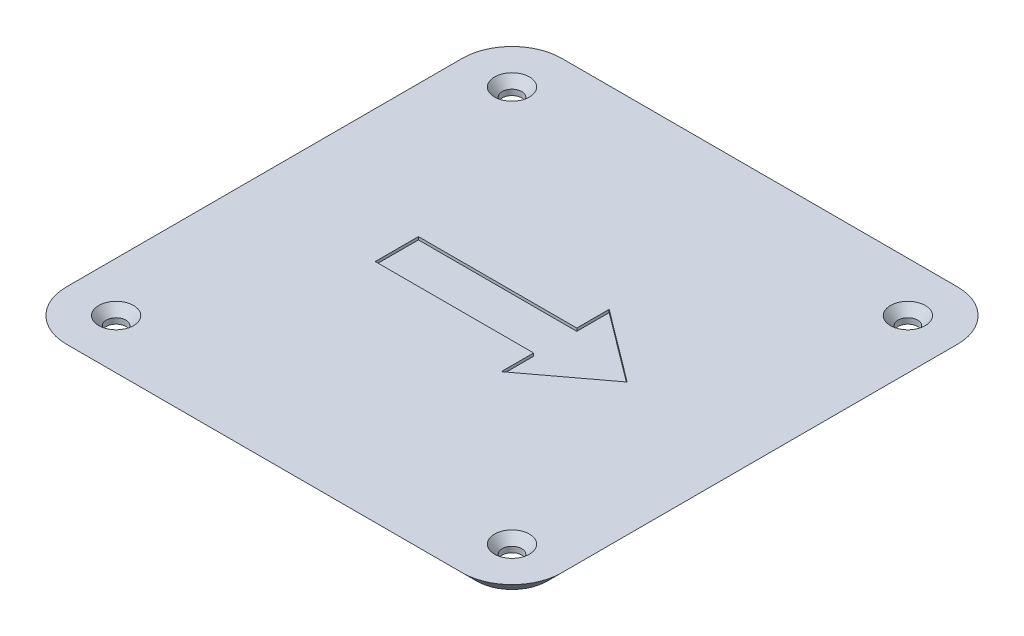
ISO-10303-21;
HEADER;
FILE_DESCRIPTION(('STEP AP214'),'2;1');
FILE_NAME('part.step','',(''),(''),'','','');
FILE_SCHEMA(('AUTOMOTIVE_DESIGN { 1 0 10303 214 1 1 1 1 }'));
ENDSEC;
DATA;
#1=APPLICATION_CONTEXT('core data for automotive mechanical design processes');
#2=APPLICATION_PROTOCOL_DEFINITION('international standard','automotive_design',2000,#1);
#3=PRODUCT_CONTEXT('',#1,'mechanical');
#4=PRODUCT('Part','Part','',(#3));
#5=PRODUCT_RELATED_PRODUCT_CATEGORY('part','',(#4));
#6=PRODUCT_DEFINITION_FORMATION('','',#4);
#7=PRODUCT_DEFINITION_CONTEXT('part definition',#1,'design');
#8=PRODUCT_DEFINITION('design','',#6,#7);
#9=PRODUCT_DEFINITION_SHAPE('','',#8);
#10=(LENGTH_UNIT() NAMED_UNIT(*) SI_UNIT(.MILLI.,.METRE.));
#11=(NAMED_UNIT(*) PLANE_ANGLE_UNIT() SI_UNIT($,.RADIAN.));
#12=(NAMED_UNIT(*) SI_UNIT($,.STERADIAN.) SOLID_ANGLE_UNIT());
#13=UNCERTAINTY_MEASURE_WITH_UNIT(LENGTH_MEASURE(1.E-05),#10,'distance_accuracy_value','');
#14=(GEOMETRIC_REPRESENTATION_CONTEXT(3) GLOBAL_UNCERTAINTY_ASSIGNED_CONTEXT((#13)) GLOBAL_UNIT_ASSIGNED_CONTEXT((#10,
#11,#12)) REPRESENTATION_CONTEXT('',''));
#15=CARTESIAN_POINT('',(0.,0.,0.));
#16=DIRECTION('',(0.,0.,1.));
#17=DIRECTION('',(1.,0.,0.));
#18=AXIS2_PLACEMENT_3D('',#15,#16,#17);
#19=CARTESIAN_POINT('',(-34.925,2.54,-34.925));
#20=DIRECTION('',(0.,1.,0.));
#21=DIRECTION('',(0.,0.,1.));
#22=AXIS2_PLACEMENT_3D('',#19,#20,#21);
#23=PLANE('',#22);
#24=DIRECTION('',(-1.,0.,0.));
#25=VECTOR('',#24,1.);
#26=CARTESIAN_POINT('',(0.,2.54,-3.81));
#27=LINE('',#26,#25);
#28=CARTESIAN_POINT('',(7.62,2.54,-3.81));
#29=VERTEX_POINT('',#28);
#30=CARTESIAN_POINT('',(-20.32,2.54,-3.81));
#31=VERTEX_POINT('',#30);
#32=EDGE_CURVE('E146',#29,#31,#27,.T.);
#33=ORIENTED_EDGE('',*,*,#32,.F.);
#34=DIRECTION('',(0.,0.,1.));
#35=VECTOR('',#34,1.);
#36=CARTESIAN_POINT('',(7.62,2.54,-3.81));
#37=LINE('',#36,#35);
#38=CARTESIAN_POINT('',(7.62,2.54,-9.525));
#39=VERTEX_POINT('',#38);
#40=EDGE_CURVE('E163',#39,#29,#37,.T.);
#41=ORIENTED_EDGE('',*,*,#40,.F.);
#42=DIRECTION('',(-0.8,0.,-0.6));
#43=VECTOR('',#42,1.);
#44=CARTESIAN_POINT('',(7.62,2.54,-9.525));
#45=LINE('',#44,#43);
#46=CARTESIAN_POINT('',(20.32,2.54,0.));
#47=VERTEX_POINT('',#46);
#48=EDGE_CURVE('E187',#47,#39,#45,.T.);
#49=ORIENTED_EDGE('',*,*,#48,.F.);
#50=DIRECTION('',(0.8,0.,-0.6));
#51=VECTOR('',#50,1.);
#52=CARTESIAN_POINT('',(20.32,2.54,0.));
#53=LINE('',#52,#51);
#54=CARTESIAN_POINT('',(7.62,2.54,9.525));
#55=VERTEX_POINT('',#54);
#56=EDGE_CURVE('E184',#55,#47,#53,.T.);
#57=ORIENTED_EDGE('',*,*,#56,.F.);
#58=DIRECTION('',(0.,0.,1.));
#59=VECTOR('',#58,1.);
#60=CARTESIAN_POINT('',(7.62,2.54,9.525));
#61=LINE('',#60,#59);
#62=CARTESIAN_POINT('',(7.62,2.54,3.81));
#63=VERTEX_POINT('',#62);
#64=EDGE_CURVE('E181',#63,#55,#61,.T.);
#65=ORIENTED_EDGE('',*,*,#64,.F.);
#66=DIRECTION('',(1.,0.,0.));
#67=VECTOR('',#66,1.);
#68=CARTESIAN_POINT('',(7.62,2.54,3.81));
#69=LINE('',#68,#67);
#70=CARTESIAN_POINT('',(-20.32,2.54,3.81));
#71=VERTEX_POINT('',#70);
#72=EDGE_CURVE('E178',#71,#63,#69,.T.);
#73=ORIENTED_EDGE('',*,*,#72,.F.);
#74=DIRECTION('',(0.,0.,1.));
#75=VECTOR('',#74,1.);
#76=CARTESIAN_POINT('',(-20.32,2.54,-3.81));
#77=LINE('',#76,#75);
#78=EDGE_CURVE('E176',#31,#71,#77,.T.);
#79=ORIENTED_EDGE('',*,*,#78,.F.);
#80=EDGE_LOOP('',(#33,#41,#49,#57,#65,#73,#79));
#81=FACE_BOUND('',#80,.T.);
#82=CARTESIAN_POINT('',(-34.925,2.54,-34.925));
#83=DIRECTION('',(0.,1.,0.));
#84=DIRECTION('',(0.,0.,1.));
#85=AXIS2_PLACEMENT_3D('',#82,#83,#84);
#86=CIRCLE('',#85,3.0783022);
#87=CARTESIAN_POINT('',(-34.925,2.54,-31.8466978));
#88=VERTEX_POINT('',#87);
#89=EDGE_CURVE('E194',#88,#88,#86,.T.);
#90=ORIENTED_EDGE('',*,*,#89,.F.);
#91=EDGE_LOOP('',(#90));
#92=FACE_BOUND('',#91,.T.);
#93=CARTESIAN_POINT('',(34.925,2.54,-34.925));
#94=DIRECTION('',(0.,1.,0.));
#95=DIRECTION('',(0.,0.,1.));
#96=AXIS2_PLACEMENT_3D('',#93,#94,#95);
#97=CIRCLE('',#96,3.0783022);
#98=CARTESIAN_POINT('',(34.925,2.54,-31.8466978));
#99=VERTEX_POINT('',#98);
#100=EDGE_CURVE('E212',#99,#99,#97,.T.);
#101=ORIENTED_EDGE('',*,*,#100,.F.);
#102=EDGE_LOOP('',(#101));
#103=FACE_BOUND('',#102,.T.);
#104=CARTESIAN_POINT('',(-34.925,2.54,34.925));
#105=DIRECTION('',(0.,1.,0.));
#106=DIRECTION('',(0.,0.,1.));
#107=AXIS2_PLACEMENT_3D('',#104,#105,#106);
#108=CIRCLE('',#107,3.0783022);
#109=CARTESIAN_POINT('',(-34.925,2.54,38.0033022));
#110=VERTEX_POINT('',#109);
#111=EDGE_CURVE('E221',#110,#110,#108,.T.);
#112=ORIENTED_EDGE('',*,*,#111,.F.);
#113=EDGE_LOOP('',(#112));
#114=FACE_BOUND('',#113,.T.);
#115=CARTESIAN_POINT('',(34.925,2.54,34.925));
#116=DIRECTION('',(0.,1.,0.));
#117=DIRECTION('',(0.,0.,1.));
#118=AXIS2_PLACEMENT_3D('',#115,#116,#117);
#119=CIRCLE('',#118,3.0783022);
#120=CARTESIAN_POINT('',(34.925,2.54,38.0033022));
#121=VERTEX_POINT('',#120);
#122=EDGE_CURVE('E230',#121,#121,#119,.T.);
#123=ORIENTED_EDGE('',*,*,#122,.F.);
#124=EDGE_LOOP('',(#123));
#125=FACE_BOUND('',#124,.T.);
#126=CARTESIAN_POINT('',(-34.925,2.54,-34.925));
#127=DIRECTION('',(0.,1.,0.));
#128=DIRECTION('',(0.,0.,1.));
#129=AXIS2_PLACEMENT_3D('',#126,#127,#128);
#130=CIRCLE('',#129,8.763);
#131=CARTESIAN_POINT('',(-34.925,2.54,-43.688));
#132=VERTEX_POINT('',#131);
#133=CARTESIAN_POINT('',(-43.688,2.54,-34.925));
#134=VERTEX_POINT('',#133);
#135=EDGE_CURVE('E240',#132,#134,#130,.T.);
#136=ORIENTED_EDGE('',*,*,#135,.T.);
#137=DIRECTION('',(0.,0.,1.));
#138=VECTOR('',#137,1.);
#139=CARTESIAN_POINT('',(-43.688,2.54,-34.925));
#140=LINE('',#139,#138);
#141=CARTESIAN_POINT('',(-43.688,2.54,34.925));
#142=VERTEX_POINT('',#141);
#143=EDGE_CURVE('E242',#134,#142,#140,.T.);
#144=ORIENTED_EDGE('',*,*,#143,.T.);
#145=CARTESIAN_POINT('',(-34.925,2.54,34.925));
#146=DIRECTION('',(0.,1.,0.));
#147=DIRECTION('',(0.,0.,1.));
#148=AXIS2_PLACEMENT_3D('',#145,#146,#147);
#149=CIRCLE('',#148,8.763);
#150=CARTESIAN_POINT('',(-34.925,2.54,43.688));
#151=VERTEX_POINT('',#150);
#152=EDGE_CURVE('E245',#142,#151,#149,.T.);
#153=ORIENTED_EDGE('',*,*,#152,.T.);
#154=DIRECTION('',(1.,0.,0.));
#155=VECTOR('',#154,1.);
#156=CARTESIAN_POINT('',(-34.925,2.54,43.688));
#157=LINE('',#156,#155);
#158=CARTESIAN_POINT('',(34.925,2.54,43.688));
#159=VERTEX_POINT('',#158);
#160=EDGE_CURVE('E247',#151,#159,#157,.T.);
#161=ORIENTED_EDGE('',*,*,#160,.T.);
#162=CARTESIAN_POINT('',(34.925,2.54,34.925));
#163=DIRECTION('',(0.,1.,0.));
#164=DIRECTION('',(0.,0.,1.));
#165=AXIS2_PLACEMENT_3D('',#162,#163,#164);
#166=CIRCLE('',#165,8.763);
#167=CARTESIAN_POINT('',(43.688,2.54,34.925));
#168=VERTEX_POINT('',#167);
#169=EDGE_CURVE('E249',#159,#168,#166,.T.);
#170=ORIENTED_EDGE('',*,*,#169,.T.);
#171=DIRECTION('',(0.,0.,-1.));
#172=VECTOR('',#171,1.);
#173=CARTESIAN_POINT('',(43.688,2.54,-34.925));
#174=LINE('',#173,#172);
#175=CARTESIAN_POINT('',(43.688,2.54,-34.925));
#176=VERTEX_POINT('',#175);
#177=EDGE_CURVE('E251',#168,#176,#174,.T.);
#178=ORIENTED_EDGE('',*,*,#177,.T.);
#179=CARTESIAN_POINT('',(34.925,2.54,-34.925));
#180=DIRECTION('',(0.,1.,0.));
#181=DIRECTION('',(0.,0.,-1.));
#182=AXIS2_PLACEMENT_3D('',#179,#180,#181);
#183=CIRCLE('',#182,8.76299999999999);
#184=CARTESIAN_POINT('',(34.925,2.54,-43.688));
#185=VERTEX_POINT('',#184);
#186=EDGE_CURVE('E253',#176,#185,#183,.T.);
#187=ORIENTED_EDGE('',*,*,#186,.T.);
#188=DIRECTION('',(-1.,0.,0.));
#189=VECTOR('',#188,1.);
#190=CARTESIAN_POINT('',(-34.925,2.54,-43.688));
#191=LINE('',#190,#189);
#192=EDGE_CURVE('E255',#185,#132,#191,.T.);
#193=ORIENTED_EDGE('',*,*,#192,.T.);
#194=EDGE_LOOP('',(#136,#144,#153,#161,#170,#178,#187,#193));
#195=FACE_BOUND('',#194,.T.);
#196=ADVANCED_FACE('F34',(#81,#92,#103,#114,#125,#195),#23,.T.);
#197=CARTESIAN_POINT('',(-34.925,0.,-34.925));
#198=DIRECTION('',(0.,1.,0.));
#199=DIRECTION('',(0.,0.,1.));
#200=AXIS2_PLACEMENT_3D('',#197,#198,#199);
#201=PLANE('',#200);
#202=CARTESIAN_POINT('',(-34.925,0.,-34.925));
#203=DIRECTION('',(0.,1.,0.));
#204=DIRECTION('',(0.,0.,1.));
#205=AXIS2_PLACEMENT_3D('',#202,#203,#204);
#206=CIRCLE('',#205,1.7272);
#207=CARTESIAN_POINT('',(-34.925,0.,-33.1978));
#208=VERTEX_POINT('',#207);
#209=EDGE_CURVE('E209',#208,#208,#206,.T.);
#210=ORIENTED_EDGE('',*,*,#209,.T.);
#211=EDGE_LOOP('',(#210));
#212=FACE_BOUND('',#211,.T.);
#213=CARTESIAN_POINT('',(34.925,0.,-34.925));
#214=DIRECTION('',(0.,1.,0.));
#215=DIRECTION('',(0.,0.,1.));
#216=AXIS2_PLACEMENT_3D('',#213,#214,#215);
#217=CIRCLE('',#216,1.7272);
#218=CARTESIAN_POINT('',(34.925,0.,-33.1978));
#219=VERTEX_POINT('',#218);
#220=EDGE_CURVE('E218',#219,#219,#217,.T.);
#221=ORIENTED_EDGE('',*,*,#220,.T.);
#222=EDGE_LOOP('',(#221));
#223=FACE_BOUND('',#222,.T.);
#224=CARTESIAN_POINT('',(-34.925,0.,34.925));
#225=DIRECTION('',(0.,1.,0.));
#226=DIRECTION('',(0.,0.,1.));
#227=AXIS2_PLACEMENT_3D('',#224,#225,#226);
#228=CIRCLE('',#227,1.7272);
#229=CARTESIAN_POINT('',(-34.925,0.,36.6522));
#230=VERTEX_POINT('',#229);
#231=EDGE_CURVE('E227',#230,#230,#228,.T.);
#232=ORIENTED_EDGE('',*,*,#231,.T.);
#233=EDGE_LOOP('',(#232));
#234=FACE_BOUND('',#233,.T.);
#235=CARTESIAN_POINT('',(34.925,0.,34.925));
#236=DIRECTION('',(0.,1.,0.));
#237=DIRECTION('',(0.,0.,1.));
#238=AXIS2_PLACEMENT_3D('',#235,#236,#237);
#239=CIRCLE('',#238,1.7272);
#240=CARTESIAN_POINT('',(34.925,0.,36.6522));
#241=VERTEX_POINT('',#240);
#242=EDGE_CURVE('E236',#241,#241,#239,.T.);
#243=ORIENTED_EDGE('',*,*,#242,.T.);
#244=EDGE_LOOP('',(#243));
#245=FACE_BOUND('',#244,.T.);
#246=CARTESIAN_POINT('',(-34.925,0.,34.925));
#247=DIRECTION('',(0.,1.,0.));
#248=DIRECTION('',(0.,0.,1.));
#249=AXIS2_PLACEMENT_3D('',#246,#247,#248);
#250=CIRCLE('',#249,6.22299999999997);
#251=CARTESIAN_POINT('',(-34.925,0.,41.148));
#252=VERTEX_POINT('',#251);
#253=CARTESIAN_POINT('',(-41.148,0.,34.925));
#254=VERTEX_POINT('',#253);
#255=EDGE_CURVE('E43',#252,#254,#250,.F.);
#256=ORIENTED_EDGE('',*,*,#255,.T.);
#257=DIRECTION('',(0.,0.,-1.));
#258=VECTOR('',#257,1.);
#259=CARTESIAN_POINT('',(-41.148,0.,-34.925));
#260=LINE('',#259,#258);
#261=CARTESIAN_POINT('',(-41.148,0.,-34.925));
#262=VERTEX_POINT('',#261);
#263=EDGE_CURVE('E11',#254,#262,#260,.T.);
#264=ORIENTED_EDGE('',*,*,#263,.T.);
#265=CARTESIAN_POINT('',(-34.925,0.,-34.925));
#266=DIRECTION('',(0.,1.,0.));
#267=DIRECTION('',(0.,0.,1.));
#268=AXIS2_PLACEMENT_3D('',#265,#266,#267);
#269=CIRCLE('',#268,6.22299999999997);
#270=CARTESIAN_POINT('',(-34.925,0.,-41.148));
#271=VERTEX_POINT('',#270);
#272=EDGE_CURVE('E267',#262,#271,#269,.F.);
#273=ORIENTED_EDGE('',*,*,#272,.T.);
#274=DIRECTION('',(1.,0.,0.));
#275=VECTOR('',#274,1.);
#276=CARTESIAN_POINT('',(-34.925,0.,-41.148));
#277=LINE('',#276,#275);
#278=CARTESIAN_POINT('',(34.925,0.,-41.1479999999999));
#279=VERTEX_POINT('',#278);
#280=EDGE_CURVE('E263',#271,#279,#277,.T.);
#281=ORIENTED_EDGE('',*,*,#280,.T.);
#282=CARTESIAN_POINT('',(34.925,0.,-34.925));
#283=DIRECTION('',(0.,1.,0.));
#284=DIRECTION('',(0.,0.,1.));
#285=AXIS2_PLACEMENT_3D('',#282,#283,#284);
#286=CIRCLE('',#285,6.22299999999996);
#287=CARTESIAN_POINT('',(41.148,0.,-34.925));
#288=VERTEX_POINT('',#287);
#289=EDGE_CURVE('E259',#279,#288,#286,.F.);
#290=ORIENTED_EDGE('',*,*,#289,.T.);
#291=DIRECTION('',(0.,0.,1.));
#292=VECTOR('',#291,1.);
#293=CARTESIAN_POINT('',(41.148,0.,-34.925));
#294=LINE('',#293,#292);
#295=CARTESIAN_POINT('',(41.148,0.,34.925));
#296=VERTEX_POINT('',#295);
#297=EDGE_CURVE('E257',#288,#296,#294,.T.);
#298=ORIENTED_EDGE('',*,*,#297,.T.);
#299=CARTESIAN_POINT('',(34.925,0.,34.925));
#300=DIRECTION('',(0.,1.,0.));
#301=DIRECTION('',(0.,0.,1.));
#302=AXIS2_PLACEMENT_3D('',#299,#300,#301);
#303=CIRCLE('',#302,6.22299999999998);
#304=CARTESIAN_POINT('',(34.925,0.,41.148));
#305=VERTEX_POINT('',#304);
#306=EDGE_CURVE('E261',#296,#305,#303,.F.);
#307=ORIENTED_EDGE('',*,*,#306,.T.);
#308=DIRECTION('',(-1.,0.,0.));
#309=VECTOR('',#308,1.);
#310=CARTESIAN_POINT('',(-34.925,0.,41.148));
#311=LINE('',#310,#309);
#312=EDGE_CURVE('E265',#305,#252,#311,.T.);
#313=ORIENTED_EDGE('',*,*,#312,.T.);
#314=EDGE_LOOP('',(#256,#264,#273,#281,#290,#298,#307,#313));
#315=FACE_BOUND('',#314,.T.);
#316=ADVANCED_FACE('F300',(#212,#223,#234,#245,#315),#201,.F.);
#317=CARTESIAN_POINT('',(43.688,2.54,-34.925));
#318=DIRECTION('',(-0.707106781186544,0.707106781186552,0.));
#319=DIRECTION('',(0.,0.,-1.));
#320=AXIS2_PLACEMENT_3D('',#317,#318,#319);
#321=PLANE('',#320);
#322=DIRECTION('',(0.707106781186552,0.707106781186544,0.));
#323=VECTOR('',#322,1.);
#324=CARTESIAN_POINT('',(41.148,0.,34.925));
#325=LINE('',#324,#323);
#326=EDGE_CURVE('E284',#296,#168,#325,.T.);
#327=ORIENTED_EDGE('',*,*,#326,.F.);
#328=ORIENTED_EDGE('',*,*,#297,.F.);
#329=DIRECTION('',(-0.707106781186552,-0.707106781186544,0.));
#330=VECTOR('',#329,1.);
#331=CARTESIAN_POINT('',(43.688,2.54,-34.925));
#332=LINE('',#331,#330);
#333=EDGE_CURVE('E38',#176,#288,#332,.T.);
#334=ORIENTED_EDGE('',*,*,#333,.F.);
#335=ORIENTED_EDGE('',*,*,#177,.F.);
#336=EDGE_LOOP('',(#327,#328,#334,#335));
#337=FACE_BOUND('',#336,.T.);
#338=ADVANCED_FACE('F36',(#337),#321,.F.);
#339=CARTESIAN_POINT('',(34.925,2.54000000000003,-34.925));
#340=DIRECTION('',(0.,1.,0.));
#341=DIRECTION('',(0.,0.,1.));
#342=AXIS2_PLACEMENT_3D('',#339,#340,#341);
#343=CONICAL_SURFACE('',#342,8.76299999999999,0.785398163397449);
#344=ORIENTED_EDGE('',*,*,#333,.T.);
#345=ORIENTED_EDGE('',*,*,#289,.F.);
#346=DIRECTION('',(0.,-0.707106781186547,0.707106781186547));
#347=VECTOR('',#346,1.);
#348=CARTESIAN_POINT('',(34.925,2.54000000000003,-43.688));
#349=LINE('',#348,#347);
#350=EDGE_CURVE('E282',#185,#279,#349,.T.);
#351=ORIENTED_EDGE('',*,*,#350,.F.);
#352=ORIENTED_EDGE('',*,*,#186,.F.);
#353=EDGE_LOOP('',(#344,#345,#351,#352));
#354=FACE_BOUND('',#353,.T.);
#355=ADVANCED_FACE('F295',(#354),#343,.T.);
#356=CARTESIAN_POINT('',(34.925,2.54000000000003,34.925));
#357=DIRECTION('',(0.,1.,0.));
#358=DIRECTION('',(0.,0.,1.));
#359=AXIS2_PLACEMENT_3D('',#356,#357,#358);
#360=CONICAL_SURFACE('',#359,8.763,0.785398163397448);
#361=ORIENTED_EDGE('',*,*,#326,.T.);
#362=ORIENTED_EDGE('',*,*,#169,.F.);
#363=DIRECTION('',(0.,0.707106781186548,0.707106781186547));
#364=VECTOR('',#363,1.);
#365=CARTESIAN_POINT('',(34.925,0.,41.148));
#366=LINE('',#365,#364);
#367=EDGE_CURVE('E279',#305,#159,#366,.T.);
#368=ORIENTED_EDGE('',*,*,#367,.F.);
#369=ORIENTED_EDGE('',*,*,#306,.F.);
#370=EDGE_LOOP('',(#361,#362,#368,#369));
#371=FACE_BOUND('',#370,.T.);
#372=ADVANCED_FACE('F315',(#371),#360,.T.);
#373=CARTESIAN_POINT('',(-34.925,2.54,-43.688));
#374=DIRECTION('',(0.,0.707106781186552,0.707106781186544));
#375=DIRECTION('',(-1.,0.,0.));
#376=AXIS2_PLACEMENT_3D('',#373,#374,#375);
#377=PLANE('',#376);
#378=ORIENTED_EDGE('',*,*,#350,.T.);
#379=ORIENTED_EDGE('',*,*,#280,.F.);
#380=DIRECTION('',(0.,-0.707106781186544,0.707106781186552));
#381=VECTOR('',#380,1.);
#382=CARTESIAN_POINT('',(-34.925,2.54,-43.688));
#383=LINE('',#382,#381);
#384=EDGE_CURVE('E276',#132,#271,#383,.T.);
#385=ORIENTED_EDGE('',*,*,#384,.F.);
#386=ORIENTED_EDGE('',*,*,#192,.F.);
#387=EDGE_LOOP('',(#378,#379,#385,#386));
#388=FACE_BOUND('',#387,.T.);
#389=ADVANCED_FACE('F306',(#388),#377,.F.);
#390=CARTESIAN_POINT('',(-34.925,2.54,43.688));
#391=DIRECTION('',(0.,0.70710678118655,-0.707106781186545));
#392=DIRECTION('',(1.,0.,0.));
#393=AXIS2_PLACEMENT_3D('',#390,#391,#392);
#394=PLANE('',#393);
#395=ORIENTED_EDGE('',*,*,#367,.T.);
#396=ORIENTED_EDGE('',*,*,#160,.F.);
#397=DIRECTION('',(0.,0.707106781186545,0.70710678118655));
#398=VECTOR('',#397,1.);
#399=CARTESIAN_POINT('',(-34.925,0.,41.148));
#400=LINE('',#399,#398);
#401=EDGE_CURVE('E273',#252,#151,#400,.T.);
#402=ORIENTED_EDGE('',*,*,#401,.F.);
#403=ORIENTED_EDGE('',*,*,#312,.F.);
#404=EDGE_LOOP('',(#395,#396,#402,#403));
#405=FACE_BOUND('',#404,.T.);
#406=ADVANCED_FACE('F318',(#405),#394,.F.);
#407=CARTESIAN_POINT('',(-34.925,2.54000000000003,-34.925));
#408=DIRECTION('',(0.,1.,0.));
#409=DIRECTION('',(0.,0.,1.));
#410=AXIS2_PLACEMENT_3D('',#407,#408,#409);
#411=CONICAL_SURFACE('',#410,8.763,0.785398163397449);
#412=ORIENTED_EDGE('',*,*,#384,.T.);
#413=ORIENTED_EDGE('',*,*,#272,.F.);
#414=DIRECTION('',(0.707106781186547,-0.707106781186547,0.));
#415=VECTOR('',#414,1.);
#416=CARTESIAN_POINT('',(-43.688,2.54000000000003,-34.925));
#417=LINE('',#416,#415);
#418=EDGE_CURVE('E271',#134,#262,#417,.T.);
#419=ORIENTED_EDGE('',*,*,#418,.F.);
#420=ORIENTED_EDGE('',*,*,#135,.F.);
#421=EDGE_LOOP('',(#412,#413,#419,#420));
#422=FACE_BOUND('',#421,.T.);
#423=ADVANCED_FACE('F310',(#422),#411,.T.);
#424=CARTESIAN_POINT('',(-34.925,2.54000000000003,34.925));
#425=DIRECTION('',(0.,1.,0.));
#426=DIRECTION('',(0.,0.,1.));
#427=AXIS2_PLACEMENT_3D('',#424,#425,#426);
#428=CONICAL_SURFACE('',#427,8.763,0.785398163397448);
#429=ORIENTED_EDGE('',*,*,#401,.T.);
#430=ORIENTED_EDGE('',*,*,#152,.F.);
#431=DIRECTION('',(-0.707106781186547,0.707106781186547,0.));
#432=VECTOR('',#431,1.);
#433=CARTESIAN_POINT('',(-41.148,0.,34.925));
#434=LINE('',#433,#432);
#435=EDGE_CURVE('E239',#254,#142,#434,.T.);
#436=ORIENTED_EDGE('',*,*,#435,.F.);
#437=ORIENTED_EDGE('',*,*,#255,.F.);
#438=EDGE_LOOP('',(#429,#430,#436,#437));
#439=FACE_BOUND('',#438,.T.);
#440=ADVANCED_FACE('F323',(#439),#428,.T.);
#441=CARTESIAN_POINT('',(-43.688,2.54,-34.925));
#442=DIRECTION('',(0.707106781186544,0.707106781186552,0.));
#443=DIRECTION('',(0.,0.,1.));
#444=AXIS2_PLACEMENT_3D('',#441,#442,#443);
#445=PLANE('',#444);
#446=ORIENTED_EDGE('',*,*,#418,.T.);
#447=ORIENTED_EDGE('',*,*,#263,.F.);
#448=ORIENTED_EDGE('',*,*,#435,.T.);
#449=ORIENTED_EDGE('',*,*,#143,.F.);
#450=EDGE_LOOP('',(#446,#447,#448,#449));
#451=FACE_BOUND('',#450,.T.);
#452=ADVANCED_FACE('F325',(#451),#445,.F.);
#453=CARTESIAN_POINT('',(34.925,2.54,34.925));
#454=DIRECTION('',(0.,1.,0.));
#455=DIRECTION('',(0.,0.,1.));
#456=AXIS2_PLACEMENT_3D('',#453,#454,#455);
#457=CYLINDRICAL_SURFACE('',#456,1.7272);
#458=ORIENTED_EDGE('',*,*,#242,.F.);
#459=EDGE_LOOP('',(#458));
#460=FACE_BOUND('',#459,.T.);
#461=CARTESIAN_POINT('',(34.925,0.9857347141932,34.925));
#462=DIRECTION('',(0.,1.,0.));
#463=DIRECTION('',(0.,0.,1.));
#464=AXIS2_PLACEMENT_3D('',#461,#462,#463);
#465=CIRCLE('',#464,1.7272);
#466=CARTESIAN_POINT('',(34.925,0.9857347141932,36.6522));
#467=VERTEX_POINT('',#466);
#468=EDGE_CURVE('E233',#467,#467,#465,.T.);
#469=ORIENTED_EDGE('',*,*,#468,.T.);
#470=EDGE_LOOP('',(#469));
#471=FACE_BOUND('',#470,.T.);
#472=ADVANCED_FACE('F327',(#460,#471),#457,.F.);
#473=CARTESIAN_POINT('',(34.925,2.54,34.925));
#474=DIRECTION('',(0.,1.,0.));
#475=DIRECTION('',(0.,0.,1.));
#476=AXIS2_PLACEMENT_3D('',#473,#474,#475);
#477=CONICAL_SURFACE('',#476,3.0783022,0.715584993317677);
#478=ORIENTED_EDGE('',*,*,#468,.F.);
#479=EDGE_LOOP('',(#478));
#480=FACE_BOUND('',#479,.T.);
#481=ORIENTED_EDGE('',*,*,#122,.T.);
#482=EDGE_LOOP('',(#481));
#483=FACE_BOUND('',#482,.T.);
#484=ADVANCED_FACE('F333',(#480,#483),#477,.F.);
#485=CARTESIAN_POINT('',(-34.925,2.54,34.925));
#486=DIRECTION('',(0.,1.,0.));
#487=DIRECTION('',(0.,0.,1.));
#488=AXIS2_PLACEMENT_3D('',#485,#486,#487);
#489=CYLINDRICAL_SURFACE('',#488,1.7272);
#490=ORIENTED_EDGE('',*,*,#231,.F.);
#491=EDGE_LOOP('',(#490));
#492=FACE_BOUND('',#491,.T.);
#493=CARTESIAN_POINT('',(-34.925,0.9857347141932,34.925));
#494=DIRECTION('',(0.,1.,0.));
#495=DIRECTION('',(0.,0.,1.));
#496=AXIS2_PLACEMENT_3D('',#493,#494,#495);
#497=CIRCLE('',#496,1.7272);
#498=CARTESIAN_POINT('',(-34.925,0.9857347141932,36.6522));
#499=VERTEX_POINT('',#498);
#500=EDGE_CURVE('E224',#499,#499,#497,.T.);
#501=ORIENTED_EDGE('',*,*,#500,.T.);
#502=EDGE_LOOP('',(#501));
#503=FACE_BOUND('',#502,.T.);
#504=ADVANCED_FACE('F349',(#492,#503),#489,.F.);
#505=CARTESIAN_POINT('',(-34.925,2.54,34.925));
#506=DIRECTION('',(0.,1.,0.));
#507=DIRECTION('',(0.,0.,1.));
#508=AXIS2_PLACEMENT_3D('',#505,#506,#507);
#509=CONICAL_SURFACE('',#508,3.0783022,0.715584993317677);
#510=ORIENTED_EDGE('',*,*,#500,.F.);
#511=EDGE_LOOP('',(#510));
#512=FACE_BOUND('',#511,.T.);
#513=ORIENTED_EDGE('',*,*,#111,.T.);
#514=EDGE_LOOP('',(#513));
#515=FACE_BOUND('',#514,.T.);
#516=ADVANCED_FACE('F353',(#512,#515),#509,.F.);
#517=CARTESIAN_POINT('',(34.925,2.54,-34.925));
#518=DIRECTION('',(0.,1.,0.));
#519=DIRECTION('',(0.,0.,1.));
#520=AXIS2_PLACEMENT_3D('',#517,#518,#519);
#521=CYLINDRICAL_SURFACE('',#520,1.7272);
#522=ORIENTED_EDGE('',*,*,#220,.F.);
#523=EDGE_LOOP('',(#522));
#524=FACE_BOUND('',#523,.T.);
#525=CARTESIAN_POINT('',(34.925,0.9857347141932,-34.925));
#526=DIRECTION('',(0.,1.,0.));
#527=DIRECTION('',(0.,0.,1.));
#528=AXIS2_PLACEMENT_3D('',#525,#526,#527);
#529=CIRCLE('',#528,1.7272);
#530=CARTESIAN_POINT('',(34.925,0.9857347141932,-33.1978));
#531=VERTEX_POINT('',#530);
#532=EDGE_CURVE('E215',#531,#531,#529,.T.);
#533=ORIENTED_EDGE('',*,*,#532,.T.);
#534=EDGE_LOOP('',(#533));
#535=FACE_BOUND('',#534,.T.);
#536=ADVANCED_FACE('F357',(#524,#535),#521,.F.);
#537=CARTESIAN_POINT('',(34.925,2.54,-34.925));
#538=DIRECTION('',(0.,1.,0.));
#539=DIRECTION('',(0.,0.,1.));
#540=AXIS2_PLACEMENT_3D('',#537,#538,#539);
#541=CONICAL_SURFACE('',#540,3.0783022,0.715584993317677);
#542=ORIENTED_EDGE('',*,*,#532,.F.);
#543=EDGE_LOOP('',(#542));
#544=FACE_BOUND('',#543,.T.);
#545=ORIENTED_EDGE('',*,*,#100,.T.);
#546=EDGE_LOOP('',(#545));
#547=FACE_BOUND('',#546,.T.);
#548=ADVANCED_FACE('F361',(#544,#547),#541,.F.);
#549=CARTESIAN_POINT('',(-34.925,2.54,-34.925));
#550=DIRECTION('',(0.,1.,0.));
#551=DIRECTION('',(0.,0.,1.));
#552=AXIS2_PLACEMENT_3D('',#549,#550,#551);
#553=CYLINDRICAL_SURFACE('',#552,1.7272);
#554=ORIENTED_EDGE('',*,*,#209,.F.);
#555=EDGE_LOOP('',(#554));
#556=FACE_BOUND('',#555,.T.);
#557=CARTESIAN_POINT('',(-34.925,0.9857347141932,-34.925));
#558=DIRECTION('',(0.,1.,0.));
#559=DIRECTION('',(0.,0.,1.));
#560=AXIS2_PLACEMENT_3D('',#557,#558,#559);
#561=CIRCLE('',#560,1.7272);
#562=CARTESIAN_POINT('',(-34.925,0.9857347141932,-33.1978));
#563=VERTEX_POINT('',#562);
#564=EDGE_CURVE('E206',#563,#563,#561,.T.);
#565=ORIENTED_EDGE('',*,*,#564,.T.);
#566=EDGE_LOOP('',(#565));
#567=FACE_BOUND('',#566,.T.);
#568=ADVANCED_FACE('F365',(#556,#567),#553,.F.);
#569=CARTESIAN_POINT('',(-34.925,2.54,-34.925));
#570=DIRECTION('',(0.,1.,0.));
#571=DIRECTION('',(0.,0.,1.));
#572=AXIS2_PLACEMENT_3D('',#569,#570,#571);
#573=CONICAL_SURFACE('',#572,3.0783022,0.715584993317677);
#574=ORIENTED_EDGE('',*,*,#564,.F.);
#575=EDGE_LOOP('',(#574));
#576=FACE_BOUND('',#575,.T.);
#577=ORIENTED_EDGE('',*,*,#89,.T.);
#578=EDGE_LOOP('',(#577));
#579=FACE_BOUND('',#578,.T.);
#580=ADVANCED_FACE('F369',(#576,#579),#573,.F.);
#581=CARTESIAN_POINT('',(0.,2.032,-3.81));
#582=DIRECTION('',(0.,0.,-1.));
#583=DIRECTION('',(-1.,0.,0.));
#584=AXIS2_PLACEMENT_3D('',#581,#582,#583);
#585=PLANE('',#584);
#586=ORIENTED_EDGE('',*,*,#32,.T.);
#587=DIRECTION('',(0.,1.,0.));
#588=VECTOR('',#587,1.);
#589=CARTESIAN_POINT('',(-20.32,2.032,-3.81));
#590=LINE('',#589,#588);
#591=CARTESIAN_POINT('',(-20.32,2.032,-3.81));
#592=VERTEX_POINT('',#591);
#593=EDGE_CURVE('E51',#592,#31,#590,.T.);
#594=ORIENTED_EDGE('',*,*,#593,.F.);
#595=DIRECTION('',(-1.,0.,0.));
#596=VECTOR('',#595,1.);
#597=CARTESIAN_POINT('',(0.,2.032,-3.81));
#598=LINE('',#597,#596);
#599=CARTESIAN_POINT('',(7.62,2.032,-3.81));
#600=VERTEX_POINT('',#599);
#601=EDGE_CURVE('E143',#600,#592,#598,.T.);
#602=ORIENTED_EDGE('',*,*,#601,.F.);
#603=DIRECTION('',(0.,1.,0.));
#604=VECTOR('',#603,1.);
#605=CARTESIAN_POINT('',(7.62,2.032,-3.81));
#606=LINE('',#605,#604);
#607=EDGE_CURVE('E192',#600,#29,#606,.T.);
#608=ORIENTED_EDGE('',*,*,#607,.T.);
#609=EDGE_LOOP('',(#586,#594,#602,#608));
#610=FACE_BOUND('',#609,.T.);
#611=ADVANCED_FACE('F141',(#610),#585,.F.);
#612=CARTESIAN_POINT('',(7.62,2.032,-3.81));
#613=DIRECTION('',(-1.,0.,0.));
#614=DIRECTION('',(0.,0.,1.));
#615=AXIS2_PLACEMENT_3D('',#612,#613,#614);
#616=PLANE('',#615);
#617=ORIENTED_EDGE('',*,*,#40,.T.);
#618=ORIENTED_EDGE('',*,*,#607,.F.);
#619=DIRECTION('',(0.,0.,1.));
#620=VECTOR('',#619,1.);
#621=CARTESIAN_POINT('',(7.62,2.032,-3.81));
#622=LINE('',#621,#620);
#623=CARTESIAN_POINT('',(7.62,2.032,-9.525));
#624=VERTEX_POINT('',#623);
#625=EDGE_CURVE('E149',#624,#600,#622,.T.);
#626=ORIENTED_EDGE('',*,*,#625,.F.);
#627=DIRECTION('',(0.,1.,0.));
#628=VECTOR('',#627,1.);
#629=CARTESIAN_POINT('',(7.62,2.032,-9.525));
#630=LINE('',#629,#628);
#631=EDGE_CURVE('E195',#624,#39,#630,.T.);
#632=ORIENTED_EDGE('',*,*,#631,.T.);
#633=EDGE_LOOP('',(#617,#618,#626,#632));
#634=FACE_BOUND('',#633,.T.);
#635=ADVANCED_FACE('F391',(#634),#616,.F.);
#636=CARTESIAN_POINT('',(7.62,2.032,-9.525));
#637=DIRECTION('',(0.6,0.,-0.8));
#638=DIRECTION('',(-0.8,0.,-0.6));
#639=AXIS2_PLACEMENT_3D('',#636,#637,#638);
#640=PLANE('',#639);
#641=ORIENTED_EDGE('',*,*,#48,.T.);
#642=ORIENTED_EDGE('',*,*,#631,.F.);
#643=DIRECTION('',(-0.8,0.,-0.6));
#644=VECTOR('',#643,1.);
#645=CARTESIAN_POINT('',(7.62,2.032,-9.525));
#646=LINE('',#645,#644);
#647=CARTESIAN_POINT('',(20.32,2.032,0.));
#648=VERTEX_POINT('',#647);
#649=EDGE_CURVE('E173',#648,#624,#646,.T.);
#650=ORIENTED_EDGE('',*,*,#649,.F.);
#651=DIRECTION('',(0.,1.,0.));
#652=VECTOR('',#651,1.);
#653=CARTESIAN_POINT('',(20.32,2.032,0.));
#654=LINE('',#653,#652);
#655=EDGE_CURVE('E197',#648,#47,#654,.T.);
#656=ORIENTED_EDGE('',*,*,#655,.T.);
#657=EDGE_LOOP('',(#641,#642,#650,#656));
#658=FACE_BOUND('',#657,.T.);
#659=ADVANCED_FACE('F387',(#658),#640,.F.);
#660=CARTESIAN_POINT('',(20.32,2.032,0.));
#661=DIRECTION('',(0.6,0.,0.8));
#662=DIRECTION('',(0.8,0.,-0.6));
#663=AXIS2_PLACEMENT_3D('',#660,#661,#662);
#664=PLANE('',#663);
#665=ORIENTED_EDGE('',*,*,#56,.T.);
#666=ORIENTED_EDGE('',*,*,#655,.F.);
#667=DIRECTION('',(0.8,0.,-0.6));
#668=VECTOR('',#667,1.);
#669=CARTESIAN_POINT('',(20.32,2.032,0.));
#670=LINE('',#669,#668);
#671=CARTESIAN_POINT('',(7.62,2.032,9.525));
#672=VERTEX_POINT('',#671);
#673=EDGE_CURVE('E170',#672,#648,#670,.T.);
#674=ORIENTED_EDGE('',*,*,#673,.F.);
#675=DIRECTION('',(0.,1.,0.));
#676=VECTOR('',#675,1.);
#677=CARTESIAN_POINT('',(7.62,2.032,9.525));
#678=LINE('',#677,#676);
#679=EDGE_CURVE('E199',#672,#55,#678,.T.);
#680=ORIENTED_EDGE('',*,*,#679,.T.);
#681=EDGE_LOOP('',(#665,#666,#674,#680));
#682=FACE_BOUND('',#681,.T.);
#683=ADVANCED_FACE('F383',(#682),#664,.F.);
#684=CARTESIAN_POINT('',(7.62,2.032,9.525));
#685=DIRECTION('',(-1.,0.,0.));
#686=DIRECTION('',(0.,0.,1.));
#687=AXIS2_PLACEMENT_3D('',#684,#685,#686);
#688=PLANE('',#687);
#689=ORIENTED_EDGE('',*,*,#64,.T.);
#690=ORIENTED_EDGE('',*,*,#679,.F.);
#691=DIRECTION('',(0.,0.,1.));
#692=VECTOR('',#691,1.);
#693=CARTESIAN_POINT('',(7.62,2.032,9.525));
#694=LINE('',#693,#692);
#695=CARTESIAN_POINT('',(7.62,2.032,3.81));
#696=VERTEX_POINT('',#695);
#697=EDGE_CURVE('E167',#696,#672,#694,.T.);
#698=ORIENTED_EDGE('',*,*,#697,.F.);
#699=DIRECTION('',(0.,1.,0.));
#700=VECTOR('',#699,1.);
#701=CARTESIAN_POINT('',(7.62,2.032,3.81));
#702=LINE('',#701,#700);
#703=EDGE_CURVE('E201',#696,#63,#702,.T.);
#704=ORIENTED_EDGE('',*,*,#703,.T.);
#705=EDGE_LOOP('',(#689,#690,#698,#704));
#706=FACE_BOUND('',#705,.T.);
#707=ADVANCED_FACE('F379',(#706),#688,.F.);
#708=CARTESIAN_POINT('',(7.62,2.032,3.81));
#709=DIRECTION('',(0.,0.,1.));
#710=DIRECTION('',(1.,0.,0.));
#711=AXIS2_PLACEMENT_3D('',#708,#709,#710);
#712=PLANE('',#711);
#713=ORIENTED_EDGE('',*,*,#72,.T.);
#714=ORIENTED_EDGE('',*,*,#703,.F.);
#715=DIRECTION('',(1.,0.,0.));
#716=VECTOR('',#715,1.);
#717=CARTESIAN_POINT('',(-20.32,2.032,3.81));
#718=LINE('',#717,#716);
#719=CARTESIAN_POINT('',(-20.32,2.032,3.81));
#720=VERTEX_POINT('',#719);
#721=EDGE_CURVE('E156',#720,#696,#718,.T.);
#722=ORIENTED_EDGE('',*,*,#721,.F.);
#723=DIRECTION('',(0.,1.,0.));
#724=VECTOR('',#723,1.);
#725=CARTESIAN_POINT('',(-20.32,2.032,3.81));
#726=LINE('',#725,#724);
#727=EDGE_CURVE('E148',#720,#71,#726,.T.);
#728=ORIENTED_EDGE('',*,*,#727,.T.);
#729=EDGE_LOOP('',(#713,#714,#722,#728));
#730=FACE_BOUND('',#729,.T.);
#731=ADVANCED_FACE('F376',(#730),#712,.F.);
#732=CARTESIAN_POINT('',(-20.32,2.032,-3.81));
#733=DIRECTION('',(-1.,0.,0.));
#734=DIRECTION('',(0.,0.,1.));
#735=AXIS2_PLACEMENT_3D('',#732,#733,#734);
#736=PLANE('',#735);
#737=ORIENTED_EDGE('',*,*,#78,.T.);
#738=ORIENTED_EDGE('',*,*,#727,.F.);
#739=DIRECTION('',(0.,0.,1.));
#740=VECTOR('',#739,1.);
#741=CARTESIAN_POINT('',(-20.32,2.032,-3.81));
#742=LINE('',#741,#740);
#743=EDGE_CURVE('E152',#592,#720,#742,.T.);
#744=ORIENTED_EDGE('',*,*,#743,.F.);
#745=ORIENTED_EDGE('',*,*,#593,.T.);
#746=EDGE_LOOP('',(#737,#738,#744,#745));
#747=FACE_BOUND('',#746,.T.);
#748=ADVANCED_FACE('F153',(#747),#736,.F.);
#749=CARTESIAN_POINT('',(0.,2.032,0.));
#750=DIRECTION('',(0.,1.,0.));
#751=DIRECTION('',(0.,0.,1.));
#752=AXIS2_PLACEMENT_3D('',#749,#750,#751);
#753=PLANE('',#752);
#754=ORIENTED_EDGE('',*,*,#601,.T.);
#755=ORIENTED_EDGE('',*,*,#743,.T.);
#756=ORIENTED_EDGE('',*,*,#721,.T.);
#757=ORIENTED_EDGE('',*,*,#697,.T.);
#758=ORIENTED_EDGE('',*,*,#673,.T.);
#759=ORIENTED_EDGE('',*,*,#649,.T.);
#760=ORIENTED_EDGE('',*,*,#625,.T.);
#761=EDGE_LOOP('',(#754,#755,#756,#757,#758,#759,#760));
#762=FACE_BOUND('',#761,.T.);
#763=ADVANCED_FACE('F159',(#762),#753,.T.);
#764=CLOSED_SHELL('',(#196,#316,#338,#355,#372,#389,#406,#423,#440,#452,#472,#484,#504,#516,
#536,#548,#568,#580,#611,#635,#659,#683,#707,#731,#748,#763));
#765=MANIFOLD_SOLID_BREP('B2',#764);
#766=ADVANCED_BREP_SHAPE_REPRESENTATION('',(#18,#765),#14);
#767=SHAPE_DEFINITION_REPRESENTATION(#9,#766);
ENDSEC;
END-ISO-10303-21;
